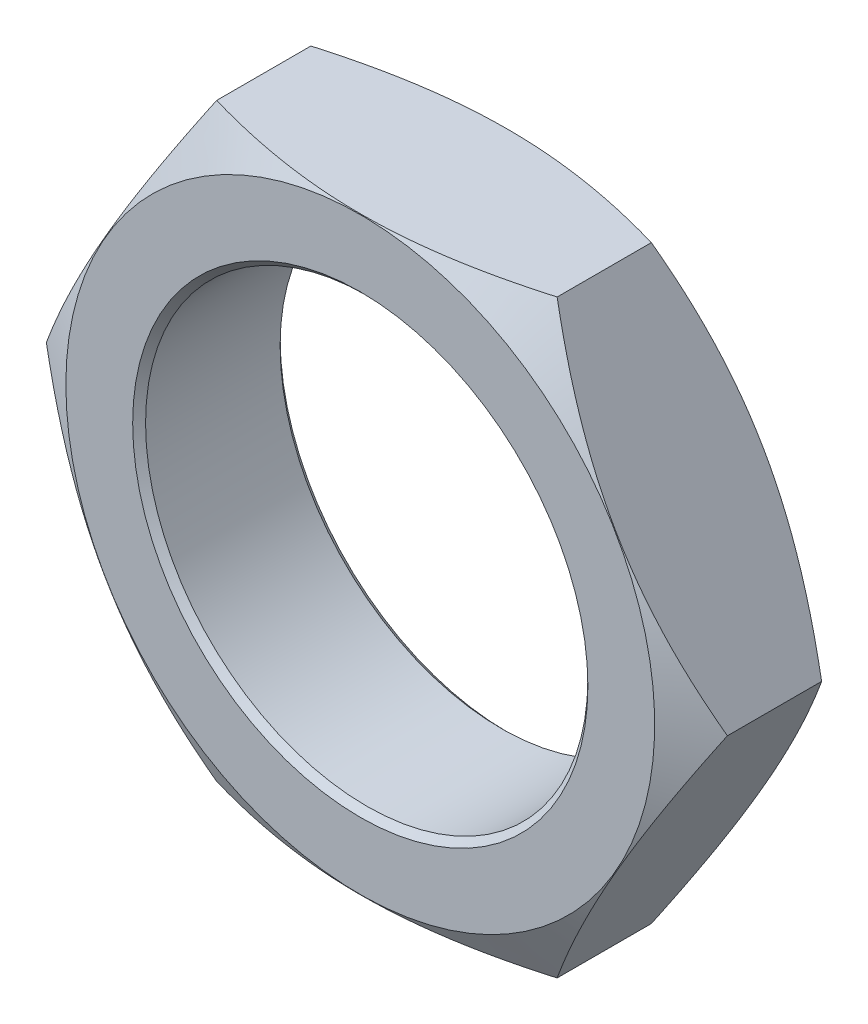
ISO-10303-21;
HEADER;
FILE_DESCRIPTION(('STEP AP214'),'2;1');
FILE_NAME('part.step','',(''),(''),'','','');
FILE_SCHEMA(('AUTOMOTIVE_DESIGN { 1 0 10303 214 1 1 1 1 }'));
ENDSEC;
DATA;
#1=APPLICATION_CONTEXT('core data for automotive mechanical design processes');
#2=APPLICATION_PROTOCOL_DEFINITION('international standard','automotive_design',2000,#1);
#3=PRODUCT_CONTEXT('',#1,'mechanical');
#4=PRODUCT('Part','Part','',(#3));
#5=PRODUCT_RELATED_PRODUCT_CATEGORY('part','',(#4));
#6=PRODUCT_DEFINITION_FORMATION('','',#4);
#7=PRODUCT_DEFINITION_CONTEXT('part definition',#1,'design');
#8=PRODUCT_DEFINITION('design','',#6,#7);
#9=PRODUCT_DEFINITION_SHAPE('','',#8);
#10=(LENGTH_UNIT() NAMED_UNIT(*) SI_UNIT(.MILLI.,.METRE.));
#11=(NAMED_UNIT(*) PLANE_ANGLE_UNIT() SI_UNIT($,.RADIAN.));
#12=(NAMED_UNIT(*) SI_UNIT($,.STERADIAN.) SOLID_ANGLE_UNIT());
#13=UNCERTAINTY_MEASURE_WITH_UNIT(LENGTH_MEASURE(1.E-05),#10,'distance_accuracy_value','');
#14=(GEOMETRIC_REPRESENTATION_CONTEXT(3) GLOBAL_UNCERTAINTY_ASSIGNED_CONTEXT((#13)) GLOBAL_UNIT_ASSIGNED_CONTEXT((#10,
#11,#12)) REPRESENTATION_CONTEXT('',''));
#15=CARTESIAN_POINT('',(0.,0.,0.));
#16=DIRECTION('',(0.,0.,1.));
#17=DIRECTION('',(1.,0.,0.));
#18=AXIS2_PLACEMENT_3D('',#15,#16,#17);
#19=CARTESIAN_POINT('',(0.,0.,3.99999999981259));
#20=DIRECTION('',(0.,0.,-1.));
#21=DIRECTION('',(-1.,0.,0.));
#22=AXIS2_PLACEMENT_3D('',#19,#20,#21);
#23=CONICAL_SURFACE('',#22,15.9752086149594,1.0471975509953);
#24=CARTESIAN_POINT('',(0.,0.,3.9999999998126));
#25=DIRECTION('',(0.,0.,-1.));
#26=DIRECTION('',(-1.,0.,0.));
#27=AXIS2_PLACEMENT_3D('',#24,#25,#26);
#28=CIRCLE('',#27,15.9752086149594);
#29=CARTESIAN_POINT('',(-15.9752086149594,0.,3.9999999998126));
#30=VERTEX_POINT('',#29);
#31=EDGE_CURVE('E18',#30,#30,#28,.F.);
#32=ORIENTED_EDGE('',*,*,#31,.F.);
#33=EDGE_LOOP('',(#32));
#34=FACE_BOUND('',#33,.T.);
#35=CARTESIAN_POINT('',(-9.23760430633802,16.0000000002868,2.55662432624329));
#36=CARTESIAN_POINT('',(-9.44064218104551,15.6483280859823,2.6738382811478));
#37=CARTESIAN_POINT('',(-9.64447201173699,15.2952844633512,2.78573308094013));
#38=CARTESIAN_POINT('',(-10.0537661353893,14.5863662461089,2.99740586359544));
#39=CARTESIAN_POINT('',(-10.2592309423805,14.2304907611711,3.09717986127837));
#40=CARTESIAN_POINT('',(-10.6721920568119,13.5152211293785,3.28326982416065));
#41=CARTESIAN_POINT('',(-10.8796919776256,13.1558207239776,3.36955394973421));
#42=CARTESIAN_POINT('',(-11.2961336541743,12.4345225818154,3.52681138974918));
#43=CARTESIAN_POINT('',(-11.5050753269531,12.0726249887383,3.59778557764242));
#44=CARTESIAN_POINT('',(-11.9190467483421,11.3556054540053,3.72140440274642));
#45=CARTESIAN_POINT('',(-12.1240457654245,11.0005367409167,3.77445820806039));
#46=CARTESIAN_POINT('',(-12.5349830849643,10.2887724247458,3.86341667736424));
#47=CARTESIAN_POINT('',(-12.7409214054263,9.93207679047865,3.89932101122753));
#48=CARTESIAN_POINT('',(-13.1531439400417,9.21808641649706,3.95307397673388));
#49=CARTESIAN_POINT('',(-13.3594274500619,8.86079289637732,3.97094406295668));
#50=CARTESIAN_POINT('',(-13.7721848206795,8.14587615926644,3.98824423119892));
#51=CARTESIAN_POINT('',(-13.9786586751971,7.788252952806,3.98767488309731));
#52=CARTESIAN_POINT('',(-14.3646519535476,7.11969298332043,3.96938503993931));
#53=CARTESIAN_POINT('',(-14.5441989009926,6.80870854800065,3.95389546455418));
#54=CARTESIAN_POINT('',(-14.9028797845511,6.18745503397134,3.90926460170259));
#55=CARTESIAN_POINT('',(-15.0820136905552,5.87718600741288,3.88012234876159));
#56=CARTESIAN_POINT('',(-15.4397711972095,5.25753182909611,3.80869419010614));
#57=CARTESIAN_POINT('',(-15.6183942530834,4.94814762091812,3.76639743064279));
#58=CARTESIAN_POINT('',(-15.9748029854701,4.33082958816085,3.66940226750519));
#59=CARTESIAN_POINT('',(-16.1525886042237,4.02289586362347,3.61470302083758));
#60=CARTESIAN_POINT('',(-16.6922662461052,3.0881467681723,3.43061889483641));
#61=CARTESIAN_POINT('',(-17.0525955452564,2.4640381145845,3.28287980816068));
#62=CARTESIAN_POINT('',(-17.7678815637374,1.2251263886271,2.94757360958301));
#63=CARTESIAN_POINT('',(-18.1228474392889,0.610307457216595,2.76008523232963));
#64=CARTESIAN_POINT('',(-18.4752086144125,-7.14475480109929E-10,2.55662432648328));
#65=B_SPLINE_CURVE_WITH_KNOTS('',3,(#35,#36,#37,#38,#39,#40,#41,#42,#43,#44,#45,#46,#47,#48,#49,
#50,#51,#52,#53,#54,#55,#56,#57,#58,#59,#60,#61,#62,#63,#64),.UNSPECIFIED.,.F.,.F.,(4,2,2,2,2,2,
2,2,2,2,2,2,2,2,4),(0.,1.26799596180862,2.53640770417564,3.80776944767192,5.0790586391343,
6.31897024048918,7.55890570912809,8.79736433403124,10.0357846838534,11.1138082621498,
12.1919080864019,13.2708998185767,14.3499649114952,16.5555443411789,18.7567951495243),.UNSPECIFIED.);
#66=CARTESIAN_POINT('',(-9.23760430716358,16.0000000002833,2.5566243265031));
#67=VERTEX_POINT('',#66);
#68=CARTESIAN_POINT('',(-18.475208614,-3.31791203485769E-09,2.55662432672144));
#69=VERTEX_POINT('',#68);
#70=EDGE_CURVE('E172',#67,#69,#65,.T.);
#71=ORIENTED_EDGE('',*,*,#70,.T.);
#72=CARTESIAN_POINT('',(-18.4752086137381,3.38518614307313E-11,2.5566243265912));
#73=CARTESIAN_POINT('',(-18.2721707394008,-0.351671914492809,2.67383828141199));
#74=CARTESIAN_POINT('',(-18.0683409088649,-0.704715537208551,2.78573308116317));
#75=CARTESIAN_POINT('',(-17.6590467853344,-1.41363375449932,2.99740586377391));
#76=CARTESIAN_POINT('',(-17.4535819783094,-1.76950923940093,3.09717986145341));
#77=CARTESIAN_POINT('',(-17.0406208638609,-2.4847788711534,3.28326982431879));
#78=CARTESIAN_POINT('',(-16.8331209430641,-2.84417927655056,3.36955394987886));
#79=CARTESIAN_POINT('',(-16.4166792665357,-3.56547741869634,3.52681138986978));
#80=CARTESIAN_POINT('',(-16.2077375937601,-3.92737501176084,3.59778557775245));
#81=CARTESIAN_POINT('',(-15.7937661723809,-4.644394546472,3.72140440283542));
#82=CARTESIAN_POINT('',(-15.5887671553048,-4.99946325955141,3.77445820813889));
#83=CARTESIAN_POINT('',(-15.1778298357768,-5.71122757570315,3.86341667742244));
#84=CARTESIAN_POINT('',(-14.9718915153204,-6.06792320996022,3.89932101127592));
#85=CARTESIAN_POINT('',(-14.5596689807166,-6.78191358392134,3.95307397676334));
#86=CARTESIAN_POINT('',(-14.3533854707026,-7.13920710403065,3.97094406297704));
#87=CARTESIAN_POINT('',(-13.9406281000973,-7.85412384112022,3.98824423120207));
#88=CARTESIAN_POINT('',(-13.7341542455859,-8.21174704756979,3.98767488309238));
#89=CARTESIAN_POINT('',(-13.3481609672544,-8.88030701702246,3.96938503992074));
#90=CARTESIAN_POINT('',(-13.1686140198221,-9.19129145232025,3.95389546453047));
#91=CARTESIAN_POINT('',(-12.8099331362891,-9.81254496630549,3.90926460167067));
#92=CARTESIAN_POINT('',(-12.6307992302978,-10.1228139928419,3.88012234872661));
#93=CARTESIAN_POINT('',(-12.2730417236688,-10.7424681711146,3.8086941900671));
#94=CARTESIAN_POINT('',(-12.0944186678076,-11.0518523792706,3.76639743060273));
#95=CARTESIAN_POINT('',(-11.7380099354462,-11.669170411984,3.66940226746507));
#96=CARTESIAN_POINT('',(-11.5602243167053,-11.9771041364995,3.6147030207984));
#97=CARTESIAN_POINT('',(-11.0205466748634,-12.911853231882,3.43061889480333));
#98=CARTESIAN_POINT('',(-10.6602173757391,-13.5359618854233,3.2828798081358));
#99=CARTESIAN_POINT('',(-9.94493135731109,-14.7748736112888,2.94757360958069));
#100=CARTESIAN_POINT('',(-9.58996548178586,-15.389692542654,2.76008523234166));
#101=CARTESIAN_POINT('',(-9.23760430668799,-16.0000000005404,2.55662432651184));
#102=B_SPLINE_CURVE_WITH_KNOTS('',3,(#72,#73,#74,#75,#76,#77,#78,#79,#80,#81,#82,#83,#84,#85,
#86,#87,#88,#89,#90,#91,#92,#93,#94,#95,#96,#97,#98,#99,#100,#101),.UNSPECIFIED.,.F.,.F.,(4,2,2,
2,2,2,2,2,2,2,2,2,2,2,4),(0.,1.26799596176309,2.53640770408624,3.80776944753948,
5.07905863895941,6.31897024027712,7.55890570887926,8.79736433374503,10.0357846835297,
11.1138082617507,12.1919080859273,13.2708998180269,14.3499649108702,16.5555443403915,
18.7567951485743),.UNSPECIFIED.);
#103=CARTESIAN_POINT('',(-9.23760430717642,-16.0000000003056,2.55662432648827));
#104=VERTEX_POINT('',#103);
#105=EDGE_CURVE('E182',#69,#104,#102,.T.);
#106=ORIENTED_EDGE('',*,*,#105,.T.);
#107=CARTESIAN_POINT('',(-9.23760430761613,-15.9999999994867,2.55662432617805));
#108=CARTESIAN_POINT('',(-8.83152855868282,-15.9999999998156,2.67383828111545));
#109=CARTESIAN_POINT('',(-8.42386889749488,-15.9999999999506,2.78573308092144));
#110=CARTESIAN_POINT('',(-7.60528065032763,-16.0000000000494,2.99740586358691));
#111=CARTESIAN_POINT('',(-7.19435103628772,-16.0000000000133,3.09717986126635));
#112=CARTESIAN_POINT('',(-6.36842880737749,-15.9999999999867,3.28326982414586));
#113=CARTESIAN_POINT('',(-5.95342896576042,-15.9999999999964,3.36955394972017));
#114=CARTESIAN_POINT('',(-5.12054561266569,-16.0000000000036,3.52681138973516));
#115=CARTESIAN_POINT('',(-4.70266226710016,-16.0000000000009,3.59778557762768));
#116=CARTESIAN_POINT('',(-3.87471942431193,-15.9999999999991,3.7214044027303));
#117=CARTESIAN_POINT('',(-3.46472139014448,-15.9999999999998,3.77445820804362));
#118=CARTESIAN_POINT('',(-2.64284675105835,-16.0000000000002,3.86341667734587));
#119=CARTESIAN_POINT('',(-2.23097011013063,-16.0000000000001,3.89932101120821));
#120=CARTESIAN_POINT('',(-1.40652504089239,-15.9999999999999,3.95307397671248));
#121=CARTESIAN_POINT('',(-0.99395802084855,-16.,3.97094406293417));
#122=CARTESIAN_POINT('',(-0.168443279606049,-16.,3.98824423117397));
#123=CARTESIAN_POINT('',(0.244504429432827,-16.,3.98767488307104));
#124=CARTESIAN_POINT('',(1.01649098612549,-16.,3.9693850399108));
#125=CARTESIAN_POINT('',(1.3755848810036,-16.,3.95389546452535));
#126=CARTESIAN_POINT('',(2.09294664809686,-16.,3.90926460167413));
#127=CARTESIAN_POINT('',(2.45121446009315,-16.,3.88012234873384));
#128=CARTESIAN_POINT('',(3.16672947337812,-16.,3.8086941900808));
#129=CARTESIAN_POINT('',(3.5239755851141,-16.,3.76639743061915));
#130=CARTESIAN_POINT('',(4.23679304986389,-16.,3.66940226748586));
#131=CARTESIAN_POINT('',(4.59236428735929,-16.,3.61470302082085));
#132=CARTESIAN_POINT('',(5.67171957108654,-16.,3.43061889482887));
#133=CARTESIAN_POINT('',(6.39237816936511,-16.,3.28287980816101));
#134=CARTESIAN_POINT('',(7.82295020628079,-16.,2.94757360960143));
#135=CARTESIAN_POINT('',(8.53288195736098,-16.,2.76008523235825));
#136=CARTESIAN_POINT('',(9.23760430758596,-16.,2.55662432652283));
#137=B_SPLINE_CURVE_WITH_KNOTS('',3,(#107,#108,#109,#110,#111,#112,#113,#114,#115,#116,#117,
#118,#119,#120,#121,#122,#123,#124,#125,#126,#127,#128,#129,#130,#131,#132,#133,#134,#135,#136),
.UNSPECIFIED.,.F.,.F.,(4,2,2,2,2,2,2,2,2,2,2,2,2,2,4),(0.,1.26799596181836,2.53640770419437,
3.80776944769888,5.07905863916924,6.31897024053124,7.55890570917711,8.79736433408762,
10.0357846839172,11.1138082621751,12.1919080863886,13.2708998185245,14.3499649114042,
16.5555443410076,18.7567951492738),.UNSPECIFIED.);
#138=CARTESIAN_POINT('',(9.23760430716359,-16.0000000002833,2.5566243265031));
#139=VERTEX_POINT('',#138);
#140=EDGE_CURVE('E77',#104,#139,#137,.T.);
#141=ORIENTED_EDGE('',*,*,#140,.T.);
#142=CARTESIAN_POINT('',(9.23760430633802,-16.0000000002868,2.55662432624329));
#143=CARTESIAN_POINT('',(9.44064218104539,-15.6483280859825,2.67383828114773));
#144=CARTESIAN_POINT('',(9.64447201173676,-15.2952844633516,2.78573308094));
#145=CARTESIAN_POINT('',(10.0537661353889,-14.5863662461098,2.9974058635952));
#146=CARTESIAN_POINT('',(10.2592309423799,-14.2304907611721,3.09717986127809));
#147=CARTESIAN_POINT('',(10.672192056811,-13.51522112938,3.28326982416028));
#148=CARTESIAN_POINT('',(10.8796919776246,-13.1558207239793,3.3695539497338));
#149=CARTESIAN_POINT('',(11.296133654173,-12.4345225818176,3.52681138974872));
#150=CARTESIAN_POINT('',(11.5050753269517,-12.0726249887407,3.59778557764195));
#151=CARTESIAN_POINT('',(11.9190467483407,-11.3556054540078,3.72140440274603));
#152=CARTESIAN_POINT('',(12.1240457654232,-11.000536740919,3.77445820806007));
#153=CARTESIAN_POINT('',(12.5349830849633,-10.2887724247476,3.86341667736404));
#154=CARTESIAN_POINT('',(12.7409214054253,-9.93207679048029,3.89932101122738));
#155=CARTESIAN_POINT('',(13.153143940041,-9.21808641649824,3.95307397673381));
#156=CARTESIAN_POINT('',(13.3594274500613,-8.86079289637826,3.97094406295665));
#157=CARTESIAN_POINT('',(13.7721848206792,-8.14587615926691,3.98824423119892));
#158=CARTESIAN_POINT('',(13.978658675197,-7.78825295280623,3.98767488309731));
#159=CARTESIAN_POINT('',(14.3646519535167,-7.11969298337391,3.96938503994077));
#160=CARTESIAN_POINT('',(14.5441989009309,-6.80870854810756,3.95389546455951));
#161=CARTESIAN_POINT('',(14.9028797844279,-6.18745503418479,3.90926460172028));
#162=CARTESIAN_POINT('',(15.0820136904013,-5.87718600767945,3.88012234878777));
#163=CARTESIAN_POINT('',(15.4397711969945,-5.25753182946856,3.80869419015363));
#164=CARTESIAN_POINT('',(15.6183942528379,-4.94814762134334,3.76639743070309));
#165=CARTESIAN_POINT('',(15.9748029851641,-4.33082958869097,3.669402267595));
#166=CARTESIAN_POINT('',(16.1525886038876,-4.02289586420571,3.61470302094407));
#167=CARTESIAN_POINT('',(16.6922662456763,-3.0881467689152,3.43061889499939));
#168=CARTESIAN_POINT('',(17.0525955447655,-2.46403811543474,3.28287980836902));
#169=CARTESIAN_POINT('',(17.7678815631249,-1.22512638968812,2.94757360989194));
#170=CARTESIAN_POINT('',(18.1228474386166,-0.610307458381065,2.76008523269373));
#171=CARTESIAN_POINT('',(18.4752086136813,-5.51945131494785E-10,2.55662432690542));
#172=B_SPLINE_CURVE_WITH_KNOTS('',3,(#142,#143,#144,#145,#146,#147,#148,#149,#150,#151,#152,
#153,#154,#155,#156,#157,#158,#159,#160,#161,#162,#163,#164,#165,#166,#167,#168,#169,#170,#171),
.UNSPECIFIED.,.F.,.F.,(4,2,2,2,2,2,2,2,2,2,2,2,2,2,4),(0.,1.26799596180788,2.53640770417416,
3.8077694476696,5.07905863913114,6.31897024048678,7.55890570912645,8.79736433403043,
10.0357846838534,11.1138082619645,12.1919080860313,13.2708998180201,14.3499649107527,
16.5555443400453,18.7567951480025),.UNSPECIFIED.);
#173=CARTESIAN_POINT('',(18.4752086118122,-3.78932862836994E-09,2.55662432798455));
#174=VERTEX_POINT('',#173);
#175=EDGE_CURVE('E73',#139,#174,#172,.T.);
#176=ORIENTED_EDGE('',*,*,#175,.T.);
#177=CARTESIAN_POINT('',(18.4752086146963,-1.20609984517982E-09,2.55662432631941));
#178=CARTESIAN_POINT('',(18.2721707402086,0.351671913268786,2.67383828106053));
#179=CARTESIAN_POINT('',(18.0683409096097,0.704715535965545,2.78573308078857));
#180=CARTESIAN_POINT('',(17.6590467860297,1.41363375324801,2.99740586340375));
#181=CARTESIAN_POINT('',(17.4535819790184,1.76950923816031,3.09717986111085));
#182=CARTESIAN_POINT('',(17.0406208645759,2.48477886992758,3.2832698240197));
#183=CARTESIAN_POINT('',(16.8331209437714,2.84417927532883,3.36955394959558));
#184=CARTESIAN_POINT('',(16.4166792672328,3.56547741748551,3.52681138962271));
#185=CARTESIAN_POINT('',(16.2077375944548,3.92737501055682,3.59778557752577));
#186=CARTESIAN_POINT('',(15.7937661730689,4.64439454528134,3.72140440264876));
#187=CARTESIAN_POINT('',(15.5887671559886,4.9994632583673,3.77445820797186));
#188=CARTESIAN_POINT('',(15.1778298364522,5.71122757453312,3.86341667729524));
#189=CARTESIAN_POINT('',(14.9718915159916,6.06792320879771,3.89932101116892));
#190=CARTESIAN_POINT('',(14.559668981379,6.78191358277412,3.95307397669643));
#191=CARTESIAN_POINT('',(14.3533854713605,7.1392071028912,3.97094406293005));
#192=CARTESIAN_POINT('',(13.9406281007457,7.85412383999704,3.9882442311943));
#193=CARTESIAN_POINT('',(13.7341542462295,8.2117470464551,3.98767488310391));
#194=CARTESIAN_POINT('',(13.3481609678667,8.88030701596205,3.96938503996627));
#195=CARTESIAN_POINT('',(13.168614020408,9.1912914513055,3.95389546458914));
#196=CARTESIAN_POINT('',(12.8099331368221,9.81254496538232,3.90926460175122));
#197=CARTESIAN_POINT('',(12.6307992308042,10.1228139919646,3.8801223488159));
#198=CARTESIAN_POINT('',(12.2730417241221,10.7424681703295,3.80869419016945));
#199=CARTESIAN_POINT('',(12.0944186682342,11.0518523785317,3.76639743070939));
#200=CARTESIAN_POINT('',(11.7380099358196,11.6691704113373,3.66940226757612));
#201=CARTESIAN_POINT('',(11.5602243170521,11.9771041358989,3.61470302090954));
#202=CARTESIAN_POINT('',(11.0205466751289,12.9118532314222,3.43061889490846));
#203=CARTESIAN_POINT('',(10.6602173759501,13.5359618850578,3.2828798082285));
#204=CARTESIAN_POINT('',(9.9449313574152,14.7748736111085,2.94757360963571));
#205=CARTESIAN_POINT('',(9.58996548183748,15.3896925425646,2.76008523237152));
#206=CARTESIAN_POINT('',(9.23760430668798,16.0000000005404,2.55662432651184));
#207=B_SPLINE_CURVE_WITH_KNOTS('',3,(#177,#178,#179,#180,#181,#182,#183,#184,#185,#186,#187,
#188,#189,#190,#191,#192,#193,#194,#195,#196,#197,#198,#199,#200,#201,#202,#203,#204,#205,#206),
.UNSPECIFIED.,.F.,.F.,(4,2,2,2,2,2,2,2,2,2,2,2,2,2,4),(0.,1.26799596178845,2.5364077041392,
3.80776944762331,5.07905863907488,6.31897024042316,7.5589057090564,8.79736433395168,
10.0357846837656,11.1138082621428,12.1919080864758,13.2708998187327,14.3499649117334,
16.5555443415814,18.7567951500871),.UNSPECIFIED.);
#208=CARTESIAN_POINT('',(9.23760430717642,16.0000000003056,2.55662432648828));
#209=VERTEX_POINT('',#208);
#210=EDGE_CURVE('E61',#174,#209,#207,.T.);
#211=ORIENTED_EDGE('',*,*,#210,.T.);
#212=CARTESIAN_POINT('',(9.23760430761613,15.9999999994867,2.55662432617805));
#213=CARTESIAN_POINT('',(8.83152855868282,15.9999999998156,2.67383828111545));
#214=CARTESIAN_POINT('',(8.42386889749488,15.9999999999506,2.78573308092144));
#215=CARTESIAN_POINT('',(7.60528065032763,16.0000000000494,2.99740586358691));
#216=CARTESIAN_POINT('',(7.19435103628772,16.0000000000133,3.09717986126635));
#217=CARTESIAN_POINT('',(6.36842880737749,15.9999999999867,3.28326982414586));
#218=CARTESIAN_POINT('',(5.95342896576042,15.9999999999964,3.36955394972017));
#219=CARTESIAN_POINT('',(5.12054561266569,16.0000000000036,3.52681138973516));
#220=CARTESIAN_POINT('',(4.70266226710016,16.0000000000009,3.59778557762768));
#221=CARTESIAN_POINT('',(3.87471942431193,15.9999999999991,3.7214044027303));
#222=CARTESIAN_POINT('',(3.46472139014448,15.9999999999998,3.77445820804362));
#223=CARTESIAN_POINT('',(2.64284675105835,16.0000000000002,3.86341667734587));
#224=CARTESIAN_POINT('',(2.23097011013064,16.0000000000001,3.89932101120821));
#225=CARTESIAN_POINT('',(1.40652504089239,15.9999999999999,3.95307397671248));
#226=CARTESIAN_POINT('',(0.993958020848551,16.,3.97094406293417));
#227=CARTESIAN_POINT('',(0.168443279606049,16.,3.98824423117397));
#228=CARTESIAN_POINT('',(-0.244504429432826,16.,3.98767488307104));
#229=CARTESIAN_POINT('',(-1.01649098612549,16.,3.9693850399108));
#230=CARTESIAN_POINT('',(-1.3755848810036,16.,3.95389546452535));
#231=CARTESIAN_POINT('',(-2.09294664809686,16.,3.90926460167413));
#232=CARTESIAN_POINT('',(-2.45121446009315,16.,3.88012234873384));
#233=CARTESIAN_POINT('',(-3.16672947337812,16.,3.8086941900808));
#234=CARTESIAN_POINT('',(-3.52397558511409,16.,3.76639743061915));
#235=CARTESIAN_POINT('',(-4.23679304986389,16.,3.66940226748586));
#236=CARTESIAN_POINT('',(-4.59236428735929,16.,3.61470302082085));
#237=CARTESIAN_POINT('',(-5.67171957108654,16.,3.43061889482887));
#238=CARTESIAN_POINT('',(-6.39237816936511,16.,3.28287980816101));
#239=CARTESIAN_POINT('',(-7.82295020628079,16.,2.94757360960143));
#240=CARTESIAN_POINT('',(-8.53288195736098,16.,2.76008523235825));
#241=CARTESIAN_POINT('',(-9.23760430758596,16.,2.55662432652283));
#242=B_SPLINE_CURVE_WITH_KNOTS('',3,(#212,#213,#214,#215,#216,#217,#218,#219,#220,#221,#222,
#223,#224,#225,#226,#227,#228,#229,#230,#231,#232,#233,#234,#235,#236,#237,#238,#239,#240,#241),
.UNSPECIFIED.,.F.,.F.,(4,2,2,2,2,2,2,2,2,2,2,2,2,2,4),(0.,1.26799596181836,2.53640770419436,
3.80776944769888,5.07905863916924,6.31897024053124,7.55890570917711,8.79736433408762,
10.0357846839172,11.1138082621751,12.1919080863886,13.2708998185245,14.3499649114042,
16.5555443410076,18.7567951492738),.UNSPECIFIED.);
#243=EDGE_CURVE('E165',#209,#67,#242,.T.);
#244=ORIENTED_EDGE('',*,*,#243,.T.);
#245=EDGE_LOOP('',(#71,#106,#141,#176,#211,#244));
#246=FACE_BOUND('',#245,.T.);
#247=ADVANCED_FACE('F14',(#34,#246),#23,.T.);
#248=CARTESIAN_POINT('',(-16.166911117,-16.166911117,4.));
#249=DIRECTION('',(0.,0.,1.));
#250=DIRECTION('',(1.,0.,0.));
#251=AXIS2_PLACEMENT_3D('',#248,#249,#250);
#252=PLANE('',#251);
#253=CARTESIAN_POINT('',(0.,0.,3.99999999999989));
#254=DIRECTION('',(0.,0.,1.));
#255=DIRECTION('',(1.,0.,0.));
#256=AXIS2_PLACEMENT_3D('',#253,#254,#255);
#257=CIRCLE('',#256,12.3499999999999);
#258=CARTESIAN_POINT('',(12.3499999999999,0.,3.99999999999989));
#259=VERTEX_POINT('',#258);
#260=EDGE_CURVE('E80',#259,#259,#257,.T.);
#261=ORIENTED_EDGE('',*,*,#260,.F.);
#262=EDGE_LOOP('',(#261));
#263=FACE_BOUND('',#262,.T.);
#264=ORIENTED_EDGE('',*,*,#31,.T.);
#265=EDGE_LOOP('',(#264));
#266=FACE_BOUND('',#265,.T.);
#267=ADVANCED_FACE('F300',(#263,#266),#252,.T.);
#268=CARTESIAN_POINT('',(9.237604307,16.,-4.105494336));
#269=DIRECTION('',(-0.866025403785236,-0.499999999998619,0.));
#270=DIRECTION('',(0.499999999998619,-0.866025403785236,0.));
#271=AXIS2_PLACEMENT_3D('',#268,#269,#270);
#272=PLANE('',#271);
#273=DIRECTION('',(0.,0.,-1.));
#274=VECTOR('',#273,1.);
#275=CARTESIAN_POINT('',(18.475208614,0.,0.));
#276=LINE('',#275,#274);
#277=CARTESIAN_POINT('',(18.4752086130422,-1.65895601725684E-09,-2.55662432727443));
#278=VERTEX_POINT('',#277);
#279=EDGE_CURVE('E64',#174,#278,#276,.T.);
#280=ORIENTED_EDGE('',*,*,#279,.T.);
#281=CARTESIAN_POINT('',(18.4752086142359,-4.08647202379109E-10,-2.55662432658523));
#282=CARTESIAN_POINT('',(18.2721707397521,0.351671914059421,-2.67383828131532));
#283=CARTESIAN_POINT('',(18.0683409091572,0.704715536749329,-2.78573308103207));
#284=CARTESIAN_POINT('',(17.6590467855852,1.41363375401795,-2.99740586362417));
#285=CARTESIAN_POINT('',(17.4535819785779,1.76950923892327,-3.09717986131949));
#286=CARTESIAN_POINT('',(17.0406208641438,2.48477887067609,-3.28326982420428));
#287=CARTESIAN_POINT('',(16.8331209433435,2.84417927606989,-3.36955394976789));
#288=CARTESIAN_POINT('',(16.4166792668137,3.56547741821135,-3.52681138977022));
#289=CARTESIAN_POINT('',(16.2077375940402,3.92737501127491,-3.59778557766076));
#290=CARTESIAN_POINT('',(15.7937661726627,4.64439454598482,-3.72140440275915));
#291=CARTESIAN_POINT('',(15.5887671555864,4.99946325906396,-3.77445820807013));
#292=CARTESIAN_POINT('',(15.1778298360581,5.7112275752157,-3.86341667736937));
#293=CARTESIAN_POINT('',(14.9718915156017,6.06792320947305,-3.89932101123102));
#294=CARTESIAN_POINT('',(14.5596689809977,6.78191358343462,-3.95307397673491));
#295=CARTESIAN_POINT('',(14.3533854709835,7.13920710354412,-3.97094406295692));
#296=CARTESIAN_POINT('',(13.9406281003778,7.85412384063432,-3.98824423119866));
#297=CARTESIAN_POINT('',(13.7341542458662,8.21174704708434,-3.98767488309735));
#298=CARTESIAN_POINT('',(13.3481609675576,8.8803070164973,-3.96938503994236));
#299=CARTESIAN_POINT('',(13.1686140201485,9.19129145175493,-3.9538954645622));
#300=CARTESIAN_POINT('',(12.8099331366616,9.81254496566033,-3.9092646017259));
#301=CARTESIAN_POINT('',(12.6307992306932,10.122813992157,-3.88012234879524));
#302=CARTESIAN_POINT('',(12.2730417241097,10.742468170351,-3.80869419016544));
#303=CARTESIAN_POINT('',(12.0944186682711,11.0518523784679,-3.76639743071739));
#304=CARTESIAN_POINT('',(11.7380099359544,11.6691704111038,-3.66940226761485));
#305=CARTESIAN_POINT('',(11.5602243172357,11.9771041355808,-3.61470302096699));
#306=CARTESIAN_POINT('',(11.0205466754629,12.9118532308436,-3.43061889503299));
#307=CARTESIAN_POINT('',(10.6602173763849,13.5359618843048,-3.28287980841125));
#308=CARTESIAN_POINT('',(9.9449313580479,14.7748736100127,-2.94757360995336));
#309=CARTESIAN_POINT('',(9.5899654825674,15.3896925413003,-2.76008523276575));
#310=CARTESIAN_POINT('',(9.23760430751367,15.9999999991103,-2.55662432698855));
#311=B_SPLINE_CURVE_WITH_KNOTS('',3,(#281,#282,#283,#284,#285,#286,#287,#288,#289,#290,#291,
#292,#293,#294,#295,#296,#297,#298,#299,#300,#301,#302,#303,#304,#305,#306,#307,#308,#309,#310),
.UNSPECIFIED.,.F.,.F.,(4,2,2,2,2,2,2,2,2,2,2,2,2,2,4),(0.,1.26799596175658,2.53640770407544,
3.80776944752676,5.07905863894553,6.31897024026568,7.55890570887079,8.79736433373831,
10.0357846835245,11.1138082616053,12.1919080856417,13.2708998176012,14.3499649103043,
16.5555443395263,18.7567951474105),.UNSPECIFIED.);
#312=CARTESIAN_POINT('',(9.23760430769601,16.,-2.55662432649107));
#313=VERTEX_POINT('',#312);
#314=EDGE_CURVE('E33',#278,#313,#311,.T.);
#315=ORIENTED_EDGE('',*,*,#314,.T.);
#316=DIRECTION('',(0.,0.,1.));
#317=VECTOR('',#316,1.);
#318=CARTESIAN_POINT('',(9.237604307,16.,0.));
#319=LINE('',#318,#317);
#320=EDGE_CURVE('E66',#313,#209,#319,.T.);
#321=ORIENTED_EDGE('',*,*,#320,.T.);
#322=ORIENTED_EDGE('',*,*,#210,.F.);
#323=EDGE_LOOP('',(#280,#315,#321,#322));
#324=FACE_BOUND('',#323,.T.);
#325=ADVANCED_FACE('F63',(#324),#272,.F.);
#326=CARTESIAN_POINT('',(-9.237604307,16.,4.203189147));
#327=DIRECTION('',(0.,-1.,0.));
#328=DIRECTION('',(0.,0.,-1.));
#329=AXIS2_PLACEMENT_3D('',#326,#327,#328);
#330=PLANE('',#329);
#331=ORIENTED_EDGE('',*,*,#320,.F.);
#332=CARTESIAN_POINT('',(9.23760430839201,16.,-2.55662432629015));
#333=CARTESIAN_POINT('',(8.83152855941472,16.,-2.67383828103145));
#334=CARTESIAN_POINT('',(8.42386889821514,16.,-2.78573308075967));
#335=CARTESIAN_POINT('',(7.60528065105167,16.,-2.99740586337521));
#336=CARTESIAN_POINT('',(7.19435103702718,16.,-3.09717986108248));
#337=CARTESIAN_POINT('',(6.3684288081387,16.,-3.28326982399166));
#338=CARTESIAN_POINT('',(5.95342896652794,16.,-3.3695539495677));
#339=CARTESIAN_POINT('',(5.12054561344725,16.,-3.52681138959515));
#340=CARTESIAN_POINT('',(4.70266226788944,16.,-3.59778557749838));
#341=CARTESIAN_POINT('',(3.87471942511317,16.,-3.72140440262184));
#342=CARTESIAN_POINT('',(3.46472139094995,16.,-3.77445820794522));
#343=CARTESIAN_POINT('',(2.64284675187167,16.,-3.86341667726906));
#344=CARTESIAN_POINT('',(2.23097011094758,16.,-3.89932101114292));
#345=CARTESIAN_POINT('',(1.40652504171688,16.,-3.95307397667073));
#346=CARTESIAN_POINT('',(0.99395802167696,16.,-3.97094406290445));
#347=CARTESIAN_POINT('',(0.168443280441928,16.,-3.98824423116881));
#348=CARTESIAN_POINT('',(-0.2445044285934,16.,-3.98767488307841));
#349=CARTESIAN_POINT('',(-1.0164909852023,16.,-3.96938503994358));
#350=CARTESIAN_POINT('',(-1.3755848800002,16.,-3.953895464574));
#351=CARTESIAN_POINT('',(-2.09294664693392,16.,-3.90926460176027));
#352=CARTESIAN_POINT('',(-2.45121445885086,16.,-3.88012234884157));
#353=CARTESIAN_POINT('',(-3.1667294719784,16.,-3.80869419023683));
#354=CARTESIAN_POINT('',(-3.5239755836363,16.,-3.76639743080188));
#355=CARTESIAN_POINT('',(-4.23679304823115,16.,-3.6694022677264));
#356=CARTESIAN_POINT('',(-4.5923642856497,16.,-3.61470302109249));
#357=CARTESIAN_POINT('',(-5.67171956913696,16.,-3.43061889520207));
#358=CARTESIAN_POINT('',(-6.39237816725453,16.,-3.28287980861095));
#359=CARTESIAN_POINT('',(-7.82295020385332,16.,-2.94757361021516));
#360=CARTESIAN_POINT('',(-8.53288195477761,16.,-2.76008523305901));
#361=CARTESIAN_POINT('',(-9.23760430484883,16.,-2.55662432731298));
#362=B_SPLINE_CURVE_WITH_KNOTS('',3,(#332,#333,#334,#335,#336,#337,#338,#339,#340,#341,#342,
#343,#344,#345,#346,#347,#348,#349,#350,#351,#352,#353,#354,#355,#356,#357,#358,#359,#360,#361),
.UNSPECIFIED.,.F.,.F.,(4,2,2,2,2,2,2,2,2,2,2,2,2,2,4),(0.,1.26799596179048,2.53640770414325,
3.80776944762921,5.07905863908261,6.31897024043577,7.5589057090739,8.79736433397423,
10.0357846837931,11.1138082618087,12.1919080857799,13.2708998176739,14.3499649103116,
16.5555443393961,18.7567951471441),.UNSPECIFIED.);
#363=CARTESIAN_POINT('',(-9.23760430637918,16.0000000010753,-2.55662432633356));
#364=VERTEX_POINT('',#363);
#365=EDGE_CURVE('E149',#313,#364,#362,.T.);
#366=ORIENTED_EDGE('',*,*,#365,.T.);
#367=DIRECTION('',(0.,0.,1.));
#368=VECTOR('',#367,1.);
#369=CARTESIAN_POINT('',(-9.237604307,16.,0.));
#370=LINE('',#369,#368);
#371=EDGE_CURVE('E171',#364,#67,#370,.T.);
#372=ORIENTED_EDGE('',*,*,#371,.T.);
#373=ORIENTED_EDGE('',*,*,#243,.F.);
#374=EDGE_LOOP('',(#331,#366,#372,#373));
#375=FACE_BOUND('',#374,.T.);
#376=ADVANCED_FACE('F156',(#375),#330,.F.);
#377=CARTESIAN_POINT('',(-18.475208614,0.,-4.105494336));
#378=DIRECTION('',(0.866025403785236,-0.499999999998619,0.));
#379=DIRECTION('',(0.499999999998619,0.866025403785236,0.));
#380=AXIS2_PLACEMENT_3D('',#377,#378,#379);
#381=PLANE('',#380);
#382=ORIENTED_EDGE('',*,*,#371,.F.);
#383=CARTESIAN_POINT('',(-9.23760430575836,16.0000000021506,-2.55662432597513));
#384=CARTESIAN_POINT('',(-9.44064218025123,15.6483280876668,-2.67383828073054));
#385=CARTESIAN_POINT('',(-9.64447201085528,15.2952844649612,-2.78573308047322));
#386=CARTESIAN_POINT('',(-10.0537661344456,14.5863662476607,-2.99740586311831));
#387=CARTESIAN_POINT('',(-10.2592309414622,14.2304907627393,-3.09717986084067));
#388=CARTESIAN_POINT('',(-10.6721920559155,13.5152211309533,-3.28326982378069));
#389=CARTESIAN_POINT('',(-10.8796919767256,13.1558207255424,-3.36955394937247));
#390=CARTESIAN_POINT('',(-11.2961336532756,12.4345225833659,-3.52681138943172));
#391=CARTESIAN_POINT('',(-11.5050753260595,12.0726249902845,-3.59778557735101));
#392=CARTESIAN_POINT('',(-11.9190467474563,11.3556054555411,-3.72140440250585));
#393=CARTESIAN_POINT('',(-12.1240457645416,11.0005367424463,-3.77445820784464));
#394=CARTESIAN_POINT('',(-12.5349830840885,10.2887724262623,-3.86341667719927));
#395=CARTESIAN_POINT('',(-12.7409214045546,9.93207679198839,-3.8993210110885));
#396=CARTESIAN_POINT('',(-13.1531439391782,9.21808641799283,-3.9530739766466));
#397=CARTESIAN_POINT('',(-13.3594274492024,8.86079289786595,-3.97094406289525));
#398=CARTESIAN_POINT('',(-13.7721848198288,8.14587616073993,-3.98824423118867));
#399=CARTESIAN_POINT('',(-13.978658674351,7.78825295427149,-3.98767488311241));
#400=CARTESIAN_POINT('',(-14.3646519527882,7.11969298463574,-3.96938503999705));
#401=CARTESIAN_POINT('',(-14.5441989003151,6.80870854917404,-3.95389546462333));
#402=CARTESIAN_POINT('',(-14.9028797840374,6.18745503486104,-3.90926460178166));
#403=CARTESIAN_POINT('',(-15.0820136901233,5.87718600816083,-3.88012234883917));
#404=CARTESIAN_POINT('',(-15.4397711969413,5.25753182956058,-3.80869419016833));
#405=CARTESIAN_POINT('',(-15.6183942528971,4.94814762124087,-3.76639743069102));
#406=CARTESIAN_POINT('',(-15.9748029854467,4.33082958820143,-3.66940226751405));
#407=CARTESIAN_POINT('',(-16.1525886042814,4.02289586352359,-3.614703020821));
#408=CARTESIAN_POINT('',(-16.6922662464117,3.08814676764137,-3.43061889472555));
#409=CARTESIAN_POINT('',(-17.0525955457292,2.46403811376562,-3.28287980796415));
#410=CARTESIAN_POINT('',(-17.7678815645366,1.22512638724293,-2.94757360918328));
#411=CARTESIAN_POINT('',(-18.1228474402482,0.610307455555038,-2.7600852318126));
#412=CARTESIAN_POINT('',(-18.4752086155295,-2.64918953802001E-09,-2.55662432583838));
#413=B_SPLINE_CURVE_WITH_KNOTS('',3,(#383,#384,#385,#386,#387,#388,#389,#390,#391,#392,#393,
#394,#395,#396,#397,#398,#399,#400,#401,#402,#403,#404,#405,#406,#407,#408,#409,#410,#411,#412),
.UNSPECIFIED.,.F.,.F.,(4,2,2,2,2,2,2,2,2,2,2,2,2,2,4),(0.,1.26799596182983,2.53640770422197,
3.80776944774868,5.07905863924282,6.31897024062746,7.55890570929702,8.79736433422813,
10.035784684078,11.1138082628637,12.1919080876052,13.2708998202721,14.3499649136829,
16.5555443443937,18.7567951537559),.UNSPECIFIED.);
#414=CARTESIAN_POINT('',(-18.4752086140149,-2.62337970359389E-09,-2.55662432671284));
#415=VERTEX_POINT('',#414);
#416=EDGE_CURVE('E136',#364,#415,#413,.T.);
#417=ORIENTED_EDGE('',*,*,#416,.T.);
#418=DIRECTION('',(0.,0.,1.));
#419=VECTOR('',#418,1.);
#420=CARTESIAN_POINT('',(-18.475208614,0.,0.));
#421=LINE('',#420,#419);
#422=EDGE_CURVE('E181',#415,#69,#421,.T.);
#423=ORIENTED_EDGE('',*,*,#422,.T.);
#424=ORIENTED_EDGE('',*,*,#70,.F.);
#425=EDGE_LOOP('',(#382,#417,#423,#424));
#426=FACE_BOUND('',#425,.T.);
#427=ADVANCED_FACE('F159',(#426),#381,.F.);
#428=CARTESIAN_POINT('',(-9.237604307,-16.,-4.105494336));
#429=DIRECTION('',(0.866025403785236,0.499999999998619,0.));
#430=DIRECTION('',(-0.499999999998619,0.866025403785236,0.));
#431=AXIS2_PLACEMENT_3D('',#428,#429,#430);
#432=PLANE('',#431);
#433=ORIENTED_EDGE('',*,*,#422,.F.);
#434=CARTESIAN_POINT('',(-18.4752086128023,-2.70812159456621E-09,-2.55662432777878));
#435=CARTESIAN_POINT('',(-18.2721707381448,-0.351671917070907,-2.67383828234172));
#436=CARTESIAN_POINT('',(-18.06834090749,-0.704715539697992,-2.78573308196314));
#437=CARTESIAN_POINT('',(-17.6590467838983,-1.41363375687873,-2.99740586442765));
#438=CARTESIAN_POINT('',(-17.4535819769312,-1.769509241759,-3.09717986209068));
#439=CARTESIAN_POINT('',(-17.0406208625513,-2.48477887345073,-3.28326982489266));
#440=CARTESIAN_POINT('',(-16.833120941765,-2.84417927880845,-3.3695539504057));
#441=CARTESIAN_POINT('',(-16.4166792652707,-3.56547742087957,-3.5268113903112));
#442=CARTESIAN_POINT('',(-16.2077375925188,-3.92737501390885,-3.59778557815546));
#443=CARTESIAN_POINT('',(-15.7937661711815,-4.64439454855146,-3.72140440316207));
#444=CARTESIAN_POINT('',(-15.5887671541238,-4.99946326159762,-3.77445820842745));
#445=CARTESIAN_POINT('',(-15.1778298346339,-5.71122757768222,-3.86341667763699));
#446=CARTESIAN_POINT('',(-14.9718915141973,-6.06792321190539,-3.89932101145453));
#447=CARTESIAN_POINT('',(-14.5596689796339,-6.78191358579675,-3.95307397687241));
#448=CARTESIAN_POINT('',(-14.3533854696405,-7.13920710587019,-3.97094406305251));
#449=CARTESIAN_POINT('',(-13.9406280990774,-7.85412384288664,-3.98824423121386));
#450=CARTESIAN_POINT('',(-13.7341542445876,-8.21174704929896,-3.98767488307408));
#451=CARTESIAN_POINT('',(-13.3481609662995,-8.88030701867653,-3.96938503985023));
#452=CARTESIAN_POINT('',(-13.1686140188889,-9.1912914539366,-3.95389546443753));
#453=CARTESIAN_POINT('',(-12.8099331353997,-9.81254496784586,-3.90926460153683));
#454=CARTESIAN_POINT('',(-12.6307992294305,-10.122813994344,-3.8801223485743));
#455=CARTESIAN_POINT('',(-12.2730417228458,-10.7424681725401,-3.80869418988193));
#456=CARTESIAN_POINT('',(-12.0944186670068,-11.0518523806577,-3.76639743040316));
#457=CARTESIAN_POINT('',(-11.7380099346897,-11.6691704132943,-3.66940226724079));
#458=CARTESIAN_POINT('',(-11.5602243159709,-11.9771041377714,-3.61470302056381));
#459=CARTESIAN_POINT('',(-11.0205466741998,-12.9118532330315,-3.43061889454449));
#460=CARTESIAN_POINT('',(-10.6602173751238,-13.5359618864891,-3.28287980786975));
#461=CARTESIAN_POINT('',(-9.94493135679177,-14.7748736121883,-2.94757360931484));
#462=CARTESIAN_POINT('',(-9.58996548131421,-15.3896925434709,-2.76008523208324));
#463=CARTESIAN_POINT('',(-9.23760430626316,-16.0000000012762,-2.55662432626657));
#464=B_SPLINE_CURVE_WITH_KNOTS('',3,(#434,#435,#436,#437,#438,#439,#440,#441,#442,#443,#444,
#445,#446,#447,#448,#449,#450,#451,#452,#453,#454,#455,#456,#457,#458,#459,#460,#461,#462,#463),
.UNSPECIFIED.,.F.,.F.,(4,2,2,2,2,2,2,2,2,2,2,2,2,2,4),(0.,1.26799596161021,2.5364077037855,
3.80776944709303,5.07905863836903,6.31897023955896,7.55890570803453,8.79736433277197,
10.0357846824278,11.1138082605213,12.1919080845704,13.2708998165433,14.3499649092598,
16.5555443385022,18.7567951464036),.UNSPECIFIED.);
#465=CARTESIAN_POINT('',(-9.23760430648432,-16.,-2.55662432684085));
#466=VERTEX_POINT('',#465);
#467=EDGE_CURVE('E193',#415,#466,#464,.T.);
#468=ORIENTED_EDGE('',*,*,#467,.T.);
#469=DIRECTION('',(0.,0.,1.));
#470=VECTOR('',#469,1.);
#471=CARTESIAN_POINT('',(-9.237604307,-16.,0.));
#472=LINE('',#471,#470);
#473=EDGE_CURVE('E187',#466,#104,#472,.T.);
#474=ORIENTED_EDGE('',*,*,#473,.T.);
#475=ORIENTED_EDGE('',*,*,#105,.F.);
#476=EDGE_LOOP('',(#433,#468,#474,#475));
#477=FACE_BOUND('',#476,.T.);
#478=ADVANCED_FACE('F188',(#477),#432,.F.);
#479=CARTESIAN_POINT('',(9.237604307,-16.,-4.203189147));
#480=DIRECTION('',(0.,1.,0.));
#481=DIRECTION('',(-1.,0.,0.));
#482=AXIS2_PLACEMENT_3D('',#479,#480,#481);
#483=PLANE('',#482);
#484=ORIENTED_EDGE('',*,*,#473,.F.);
#485=CARTESIAN_POINT('',(-9.23760430588794,-15.9999999995374,-2.55662432671017));
#486=CARTESIAN_POINT('',(-8.8315285569652,-15.9999999998338,-2.67383828160671));
#487=CARTESIAN_POINT('',(-8.42386889579109,-15.9999999999555,-2.785733081383));
#488=CARTESIAN_POINT('',(-7.60528064865448,-16.0000000000445,-2.99740586399854));
#489=CARTESIAN_POINT('',(-7.19435103463139,-16.0000000000119,-3.09717986165775));
#490=CARTESIAN_POINT('',(-6.36842880575486,-15.999999999988,-3.28326982449322));
#491=CARTESIAN_POINT('',(-5.95342896415469,-15.9999999999968,-3.36955395004372));
#492=CARTESIAN_POINT('',(-5.12054561109456,-16.0000000000032,-3.52681139001144));
#493=CARTESIAN_POINT('',(-4.70266226554672,-16.0000000000008,-3.5977855778805));
#494=CARTESIAN_POINT('',(-3.87471942279264,-15.9999999999992,-3.72140440293679));
#495=CARTESIAN_POINT('',(-3.4647213886416,-15.9999999999998,-3.77445820822719));
#496=CARTESIAN_POINT('',(-2.64284674958918,-16.0000000000002,-3.863416677484));
#497=CARTESIAN_POINT('',(-2.23097010867877,-16.0000000000001,-3.8993210113238));
#498=CARTESIAN_POINT('',(-1.40652503947599,-15.9999999999999,-3.95307397678393));
#499=CARTESIAN_POINT('',(-0.993958019450331,-16.,-3.97094406298398));
#500=CARTESIAN_POINT('',(-0.168443278245149,-16.,-3.98824423118198));
#501=CARTESIAN_POINT('',(0.244504430774582,-16.,-3.98767488305889));
#502=CARTESIAN_POINT('',(1.01649098738084,-16.,-3.96938503986396));
#503=CARTESIAN_POINT('',(1.37558488219183,-16.,-3.95389546446568));
#504=CARTESIAN_POINT('',(2.09294664915066,-16.,-3.90926460159432));
#505=CARTESIAN_POINT('',(2.45121446107961,-16.,-3.8801223486467));
#506=CARTESIAN_POINT('',(3.16672947422986,-16.,-3.80869418998443));
#507=CARTESIAN_POINT('',(3.52397558589844,-16.,-3.76639743052089));
#508=CARTESIAN_POINT('',(4.23679305051385,-16.,-3.66940226738895));
#509=CARTESIAN_POINT('',(4.59236428794225,-16.,-3.61470302072719));
#510=CARTESIAN_POINT('',(5.67171957146209,-16.,-3.43061889475306));
#511=CARTESIAN_POINT('',(6.39237816960128,-16.,-3.28287980810761));
#512=CARTESIAN_POINT('',(7.82295020624253,-16.,-2.94757360960844));
#513=CARTESIAN_POINT('',(8.53288195718765,-16.,-2.76008523240318));
#514=CARTESIAN_POINT('',(9.23760430727973,-16.,-2.55662432661124));
#515=B_SPLINE_CURVE_WITH_KNOTS('',3,(#485,#486,#487,#488,#489,#490,#491,#492,#493,#494,#495,
#496,#497,#498,#499,#500,#501,#502,#503,#504,#505,#506,#507,#508,#509,#510,#511,#512,#513,#514),
.UNSPECIFIED.,.F.,.F.,(4,2,2,2,2,2,2,2,2,2,2,2,2,2,4),(0.,1.26799596175475,2.53640770406757,
3.8077694475078,5.07905863891403,6.31897024021837,7.55890570880668,8.79736433365994,
10.0357846834323,11.1138082614908,12.1919080855049,13.2708998174409,14.3499649101205,
16.5555443393017,18.7567951471481),.UNSPECIFIED.);
#516=CARTESIAN_POINT('',(9.23760430698502,-16.0000000000259,-2.55662432668334));
#517=VERTEX_POINT('',#516);
#518=EDGE_CURVE('E117',#466,#517,#515,.T.);
#519=ORIENTED_EDGE('',*,*,#518,.T.);
#520=DIRECTION('',(0.,0.,1.));
#521=VECTOR('',#520,1.);
#522=CARTESIAN_POINT('',(9.237604307,-16.,0.));
#523=LINE('',#522,#521);
#524=EDGE_CURVE('E76',#517,#139,#523,.T.);
#525=ORIENTED_EDGE('',*,*,#524,.T.);
#526=ORIENTED_EDGE('',*,*,#140,.F.);
#527=EDGE_LOOP('',(#484,#519,#525,#526));
#528=FACE_BOUND('',#527,.T.);
#529=ADVANCED_FACE('F104',(#528),#483,.F.);
#530=CARTESIAN_POINT('',(18.475208614,0.,-4.105494336));
#531=DIRECTION('',(-0.866025403785236,0.499999999998619,0.));
#532=DIRECTION('',(-0.499999999998619,-0.866025403785236,0.));
#533=AXIS2_PLACEMENT_3D('',#530,#531,#532);
#534=PLANE('',#533);
#535=ORIENTED_EDGE('',*,*,#524,.F.);
#536=CARTESIAN_POINT('',(9.23760430697005,-16.0000000000519,-2.55662432667469));
#537=CARTESIAN_POINT('',(9.44064218145263,-15.648328085586,-2.67383828140113));
#538=CARTESIAN_POINT('',(9.64447201204634,-15.2952844628982,-2.78573308111411));
#539=CARTESIAN_POINT('',(10.0537661356158,-14.5863662456339,-2.99740586369853));
#540=CARTESIAN_POINT('',(10.2592309426218,-14.2304907607308,-3.09717986138992));
#541=CARTESIAN_POINT('',(10.6721920570533,-13.5152211289825,-3.28326982426667));
#542=CARTESIAN_POINT('',(10.8796919778522,-13.1558207235911,-3.36955394982618));
#543=CARTESIAN_POINT('',(11.2961336543793,-12.4345225814544,-3.5268113898202));
#544=CARTESIAN_POINT('',(11.5050753271514,-12.0726249883932,-3.59778557770653));
#545=CARTESIAN_POINT('',(11.9190467485261,-11.3556054536882,-3.72140440279658));
#546=CARTESIAN_POINT('',(12.1240457656009,-11.0005367406115,-3.77445820810343));
#547=CARTESIAN_POINT('',(12.5349830851263,-10.2887724244648,-3.86341667739446));
#548=CARTESIAN_POINT('',(12.7409214055813,-9.93207679021009,-3.89932101125203));
#549=CARTESIAN_POINT('',(13.1531439401822,-9.21808641625384,-3.95307397674791));
#550=CARTESIAN_POINT('',(13.3594274501948,-8.86079289614708,-3.97094406296599));
#551=CARTESIAN_POINT('',(13.7721848207972,-8.14587615906248,-3.98824423120012));
#552=CARTESIAN_POINT('',(13.9786586753072,-7.78825295261534,-3.98767488309513));
#553=CARTESIAN_POINT('',(14.36465195362,-7.11969298319509,-3.96938503993324));
#554=CARTESIAN_POINT('',(14.5441989010349,-6.80870854792729,-3.95389546454923));
#555=CARTESIAN_POINT('',(14.9028797845336,-6.18745503400172,-3.90926460170446));
#556=CARTESIAN_POINT('',(15.0820136905077,-5.87718600749502,-3.88012234876916));
#557=CARTESIAN_POINT('',(15.4397711971026,-5.25753182928121,-3.80869419012939));
#558=CARTESIAN_POINT('',(15.618394252947,-4.94814762115443,-3.76639743067601));
#559=CARTESIAN_POINT('',(15.9748029852749,-4.33082958849901,-3.66940226756224));
#560=CARTESIAN_POINT('',(16.1525886039992,-4.02289586401226,-3.61470302090849));
#561=CARTESIAN_POINT('',(16.6922662457891,-3.08814676871975,-3.43061889495577));
#562=CARTESIAN_POINT('',(17.0525955448786,-2.46403811523885,-3.28287980832048));
#563=CARTESIAN_POINT('',(17.7678815632379,-1.22512638949228,-2.94757360983447));
#564=CARTESIAN_POINT('',(18.1228474387293,-0.610307458185703,-2.76008523263231));
#565=CARTESIAN_POINT('',(18.4752086137939,-3.5702682756951E-10,-2.55662432684045));
#566=B_SPLINE_CURVE_WITH_KNOTS('',3,(#536,#537,#538,#539,#540,#541,#542,#543,#544,#545,#546,
#547,#548,#549,#550,#551,#552,#553,#554,#555,#556,#557,#558,#559,#560,#561,#562,#563,#564,#565),
.UNSPECIFIED.,.F.,.F.,(4,2,2,2,2,2,2,2,2,2,2,2,2,2,4),(0.,1.2679959617464,2.53640770405506,
3.80776944749595,5.0790586389043,6.31897024021443,7.55890570880952,8.79736433366709,
10.0357846834433,11.1138082615598,12.1919080856319,13.2708998176271,14.3499649103661,
16.5555443396632,18.7567951476219),.UNSPECIFIED.);
#567=EDGE_CURVE('E75',#517,#278,#566,.T.);
#568=ORIENTED_EDGE('',*,*,#567,.T.);
#569=ORIENTED_EDGE('',*,*,#279,.F.);
#570=ORIENTED_EDGE('',*,*,#175,.F.);
#571=EDGE_LOOP('',(#535,#568,#569,#570));
#572=FACE_BOUND('',#571,.T.);
#573=ADVANCED_FACE('F72',(#572),#534,.F.);
#574=CARTESIAN_POINT('',(0.,0.,3.65));
#575=DIRECTION('',(0.,0.,1.));
#576=DIRECTION('',(1.,0.,0.));
#577=AXIS2_PLACEMENT_3D('',#574,#575,#576);
#578=CONICAL_SURFACE('',#577,12.,0.78539816339745);
#579=ORIENTED_EDGE('',*,*,#260,.T.);
#580=EDGE_LOOP('',(#579));
#581=FACE_BOUND('',#580,.T.);
#582=CARTESIAN_POINT('',(0.,0.,3.65));
#583=DIRECTION('',(0.,0.,-1.));
#584=DIRECTION('',(-1.,0.,0.));
#585=AXIS2_PLACEMENT_3D('',#582,#583,#584);
#586=CIRCLE('',#585,12.);
#587=CARTESIAN_POINT('',(-12.,0.,3.65));
#588=VERTEX_POINT('',#587);
#589=EDGE_CURVE('E116',#588,#588,#586,.F.);
#590=ORIENTED_EDGE('',*,*,#589,.F.);
#591=EDGE_LOOP('',(#590));
#592=FACE_BOUND('',#591,.T.);
#593=ADVANCED_FACE('F103',(#581,#592),#578,.F.);
#594=CARTESIAN_POINT('',(0.,0.,-3.99999999981262));
#595=DIRECTION('',(0.,0.,1.));
#596=DIRECTION('',(1.,0.,0.));
#597=AXIS2_PLACEMENT_3D('',#594,#595,#596);
#598=CONICAL_SURFACE('',#597,15.9752086149594,1.0471975509953);
#599=CARTESIAN_POINT('',(0.,0.,-3.9999999998126));
#600=DIRECTION('',(0.,0.,1.));
#601=DIRECTION('',(1.,0.,0.));
#602=AXIS2_PLACEMENT_3D('',#599,#600,#601);
#603=CIRCLE('',#602,15.9752086149594);
#604=CARTESIAN_POINT('',(15.9752086149594,0.,-3.9999999998126));
#605=VERTEX_POINT('',#604);
#606=EDGE_CURVE('E118',#605,#605,#603,.T.);
#607=ORIENTED_EDGE('',*,*,#606,.T.);
#608=EDGE_LOOP('',(#607));
#609=FACE_BOUND('',#608,.T.);
#610=ORIENTED_EDGE('',*,*,#314,.F.);
#611=ORIENTED_EDGE('',*,*,#567,.F.);
#612=ORIENTED_EDGE('',*,*,#518,.F.);
#613=ORIENTED_EDGE('',*,*,#467,.F.);
#614=ORIENTED_EDGE('',*,*,#416,.F.);
#615=ORIENTED_EDGE('',*,*,#365,.F.);
#616=EDGE_LOOP('',(#610,#611,#612,#613,#614,#615));
#617=FACE_BOUND('',#616,.T.);
#618=ADVANCED_FACE('F124',(#609,#617),#598,.T.);
#619=CARTESIAN_POINT('',(0.,0.,3.65));
#620=DIRECTION('',(0.,0.,-1.));
#621=DIRECTION('',(-1.,0.,0.));
#622=AXIS2_PLACEMENT_3D('',#619,#620,#621);
#623=CYLINDRICAL_SURFACE('',#622,12.);
#624=CARTESIAN_POINT('',(0.,0.,-3.65000000000004));
#625=DIRECTION('',(0.,0.,-1.));
#626=DIRECTION('',(-1.,0.,0.));
#627=AXIS2_PLACEMENT_3D('',#624,#625,#626);
#628=CIRCLE('',#627,12.);
#629=CARTESIAN_POINT('',(-12.,0.,-3.65));
#630=VERTEX_POINT('',#629);
#631=EDGE_CURVE('E24',#630,#630,#628,.F.);
#632=ORIENTED_EDGE('',*,*,#631,.F.);
#633=EDGE_LOOP('',(#632));
#634=FACE_BOUND('',#633,.T.);
#635=ORIENTED_EDGE('',*,*,#589,.T.);
#636=EDGE_LOOP('',(#635));
#637=FACE_BOUND('',#636,.T.);
#638=ADVANCED_FACE('F128',(#634,#637),#623,.F.);
#639=CARTESIAN_POINT('',(-16.166911117,-16.166911117,-4.));
#640=DIRECTION('',(0.,0.,1.));
#641=DIRECTION('',(1.,0.,0.));
#642=AXIS2_PLACEMENT_3D('',#639,#640,#641);
#643=PLANE('',#642);
#644=CARTESIAN_POINT('',(0.,0.,-4.));
#645=DIRECTION('',(0.,0.,-1.));
#646=DIRECTION('',(-1.,0.,0.));
#647=AXIS2_PLACEMENT_3D('',#644,#645,#646);
#648=CIRCLE('',#647,12.35);
#649=CARTESIAN_POINT('',(-12.35,0.,-4.));
#650=VERTEX_POINT('',#649);
#651=EDGE_CURVE('E9',#650,#650,#648,.T.);
#652=ORIENTED_EDGE('',*,*,#651,.F.);
#653=EDGE_LOOP('',(#652));
#654=FACE_BOUND('',#653,.T.);
#655=ORIENTED_EDGE('',*,*,#606,.F.);
#656=EDGE_LOOP('',(#655));
#657=FACE_BOUND('',#656,.T.);
#658=ADVANCED_FACE('F16',(#654,#657),#643,.F.);
#659=CARTESIAN_POINT('',(0.,0.,-3.65));
#660=DIRECTION('',(0.,0.,-1.));
#661=DIRECTION('',(-1.,0.,0.));
#662=AXIS2_PLACEMENT_3D('',#659,#660,#661);
#663=CONICAL_SURFACE('',#662,12.,0.78539816339745);
#664=ORIENTED_EDGE('',*,*,#631,.T.);
#665=EDGE_LOOP('',(#664));
#666=FACE_BOUND('',#665,.T.);
#667=ORIENTED_EDGE('',*,*,#651,.T.);
#668=EDGE_LOOP('',(#667));
#669=FACE_BOUND('',#668,.T.);
#670=ADVANCED_FACE('F234',(#666,#669),#663,.F.);
#671=CLOSED_SHELL('',(#247,#267,#325,#376,#427,#478,#529,#573,#593,#618,#638,#658,#670));
#672=MANIFOLD_SOLID_BREP('B1',#671);
#673=ADVANCED_BREP_SHAPE_REPRESENTATION('',(#18,#672),#14);
#674=SHAPE_DEFINITION_REPRESENTATION(#9,#673);
ENDSEC;
END-ISO-10303-21;
